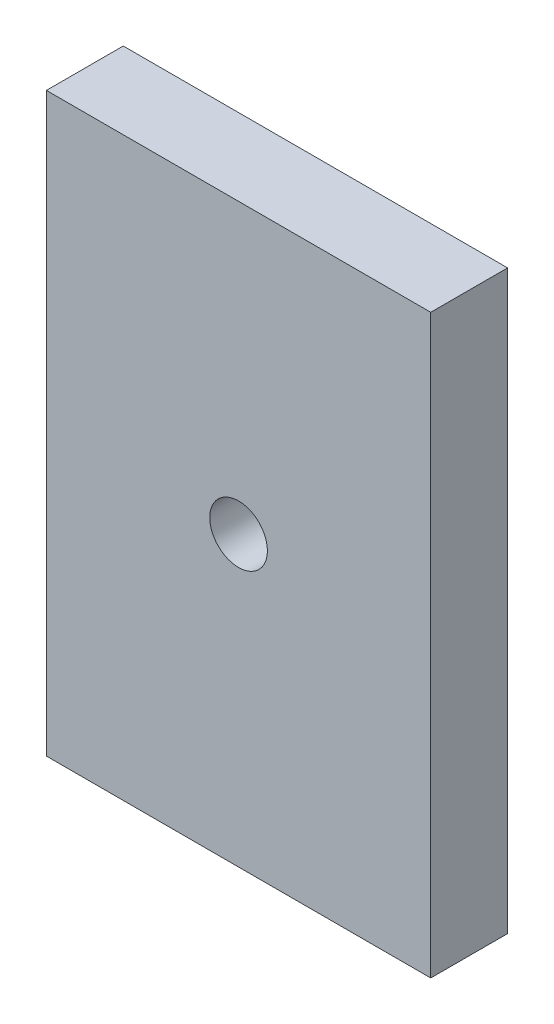
ISO-10303-21;
HEADER;
FILE_DESCRIPTION(('STEP AP214'),'2;1');
FILE_NAME('part.step','',(''),(''),'','','');
FILE_SCHEMA(('AUTOMOTIVE_DESIGN { 1 0 10303 214 1 1 1 1 }'));
ENDSEC;
DATA;
#1=APPLICATION_CONTEXT('core data for automotive mechanical design processes');
#2=APPLICATION_PROTOCOL_DEFINITION('international standard','automotive_design',2000,#1);
#3=PRODUCT_CONTEXT('',#1,'mechanical');
#4=PRODUCT('Part','Part','',(#3));
#5=PRODUCT_RELATED_PRODUCT_CATEGORY('part','',(#4));
#6=PRODUCT_DEFINITION_FORMATION('','',#4);
#7=PRODUCT_DEFINITION_CONTEXT('part definition',#1,'design');
#8=PRODUCT_DEFINITION('design','',#6,#7);
#9=PRODUCT_DEFINITION_SHAPE('','',#8);
#10=(LENGTH_UNIT() NAMED_UNIT(*) SI_UNIT(.MILLI.,.METRE.));
#11=(NAMED_UNIT(*) PLANE_ANGLE_UNIT() SI_UNIT($,.RADIAN.));
#12=(NAMED_UNIT(*) SI_UNIT($,.STERADIAN.) SOLID_ANGLE_UNIT());
#13=UNCERTAINTY_MEASURE_WITH_UNIT(LENGTH_MEASURE(1.E-05),#10,'distance_accuracy_value','');
#14=(GEOMETRIC_REPRESENTATION_CONTEXT(3) GLOBAL_UNCERTAINTY_ASSIGNED_CONTEXT((#13)) GLOBAL_UNIT_ASSIGNED_CONTEXT((#10,
#11,#12)) REPRESENTATION_CONTEXT('',''));
#15=CARTESIAN_POINT('',(0.,0.,0.));
#16=DIRECTION('',(0.,0.,1.));
#17=DIRECTION('',(1.,0.,0.));
#18=AXIS2_PLACEMENT_3D('',#15,#16,#17);
#19=CARTESIAN_POINT('',(10.,-15.,4.));
#20=DIRECTION('',(-1.,0.,0.));
#21=DIRECTION('',(0.,0.,1.));
#22=AXIS2_PLACEMENT_3D('',#19,#20,#21);
#23=PLANE('',#22);
#24=DIRECTION('',(0.,1.,0.));
#25=VECTOR('',#24,1.);
#26=CARTESIAN_POINT('',(10.,-15.,0.));
#27=LINE('',#26,#25);
#28=CARTESIAN_POINT('',(10.,-15.,0.));
#29=VERTEX_POINT('',#28);
#30=CARTESIAN_POINT('',(10.,15.,0.));
#31=VERTEX_POINT('',#30);
#32=EDGE_CURVE('E96',#29,#31,#27,.T.);
#33=ORIENTED_EDGE('',*,*,#32,.T.);
#34=DIRECTION('',(0.,0.,-1.));
#35=VECTOR('',#34,1.);
#36=CARTESIAN_POINT('',(10.,15.,4.));
#37=LINE('',#36,#35);
#38=CARTESIAN_POINT('',(10.,15.,4.));
#39=VERTEX_POINT('',#38);
#40=EDGE_CURVE('E11',#39,#31,#37,.T.);
#41=ORIENTED_EDGE('',*,*,#40,.F.);
#42=DIRECTION('',(0.,1.,0.));
#43=VECTOR('',#42,1.);
#44=CARTESIAN_POINT('',(10.,-15.,4.));
#45=LINE('',#44,#43);
#46=CARTESIAN_POINT('',(10.,-15.,4.));
#47=VERTEX_POINT('',#46);
#48=EDGE_CURVE('E84',#47,#39,#45,.T.);
#49=ORIENTED_EDGE('',*,*,#48,.F.);
#50=DIRECTION('',(0.,0.,-1.));
#51=VECTOR('',#50,1.);
#52=CARTESIAN_POINT('',(10.,-15.,4.));
#53=LINE('',#52,#51);
#54=EDGE_CURVE('E92',#47,#29,#53,.T.);
#55=ORIENTED_EDGE('',*,*,#54,.T.);
#56=EDGE_LOOP('',(#33,#41,#49,#55));
#57=FACE_BOUND('',#56,.T.);
#58=ADVANCED_FACE('F33',(#57),#23,.F.);
#59=CARTESIAN_POINT('',(-10.,15.,4.));
#60=DIRECTION('',(0.,-1.,0.));
#61=DIRECTION('',(0.,0.,-1.));
#62=AXIS2_PLACEMENT_3D('',#59,#60,#61);
#63=PLANE('',#62);
#64=DIRECTION('',(-1.,0.,0.));
#65=VECTOR('',#64,1.);
#66=CARTESIAN_POINT('',(-10.,15.,0.));
#67=LINE('',#66,#65);
#68=CARTESIAN_POINT('',(-10.,15.,0.));
#69=VERTEX_POINT('',#68);
#70=EDGE_CURVE('E88',#31,#69,#67,.T.);
#71=ORIENTED_EDGE('',*,*,#70,.T.);
#72=DIRECTION('',(0.,0.,-1.));
#73=VECTOR('',#72,1.);
#74=CARTESIAN_POINT('',(-10.,15.,4.));
#75=LINE('',#74,#73);
#76=CARTESIAN_POINT('',(-10.,15.,4.));
#77=VERTEX_POINT('',#76);
#78=EDGE_CURVE('E41',#77,#69,#75,.T.);
#79=ORIENTED_EDGE('',*,*,#78,.F.);
#80=DIRECTION('',(-1.,0.,0.));
#81=VECTOR('',#80,1.);
#82=CARTESIAN_POINT('',(-10.,15.,4.));
#83=LINE('',#82,#81);
#84=EDGE_CURVE('E79',#39,#77,#83,.T.);
#85=ORIENTED_EDGE('',*,*,#84,.F.);
#86=ORIENTED_EDGE('',*,*,#40,.T.);
#87=EDGE_LOOP('',(#71,#79,#85,#86));
#88=FACE_BOUND('',#87,.T.);
#89=ADVANCED_FACE('F87',(#88),#63,.F.);
#90=CARTESIAN_POINT('',(-10.,-15.,4.));
#91=DIRECTION('',(1.,0.,0.));
#92=DIRECTION('',(0.,0.,-1.));
#93=AXIS2_PLACEMENT_3D('',#90,#91,#92);
#94=PLANE('',#93);
#95=DIRECTION('',(0.,-1.,0.));
#96=VECTOR('',#95,1.);
#97=CARTESIAN_POINT('',(-10.,-15.,0.));
#98=LINE('',#97,#96);
#99=CARTESIAN_POINT('',(-10.,-15.,0.));
#100=VERTEX_POINT('',#99);
#101=EDGE_CURVE('E66',#69,#100,#98,.T.);
#102=ORIENTED_EDGE('',*,*,#101,.T.);
#103=DIRECTION('',(0.,0.,-1.));
#104=VECTOR('',#103,1.);
#105=CARTESIAN_POINT('',(-10.,-15.,4.));
#106=LINE('',#105,#104);
#107=CARTESIAN_POINT('',(-10.,-15.,4.));
#108=VERTEX_POINT('',#107);
#109=EDGE_CURVE('E89',#108,#100,#106,.T.);
#110=ORIENTED_EDGE('',*,*,#109,.F.);
#111=DIRECTION('',(0.,-1.,0.));
#112=VECTOR('',#111,1.);
#113=CARTESIAN_POINT('',(-10.,-15.,4.));
#114=LINE('',#113,#112);
#115=EDGE_CURVE('E82',#77,#108,#114,.T.);
#116=ORIENTED_EDGE('',*,*,#115,.F.);
#117=ORIENTED_EDGE('',*,*,#78,.T.);
#118=EDGE_LOOP('',(#102,#110,#116,#117));
#119=FACE_BOUND('',#118,.T.);
#120=ADVANCED_FACE('F90',(#119),#94,.F.);
#121=CARTESIAN_POINT('',(-10.,-15.,4.));
#122=DIRECTION('',(0.,1.,0.));
#123=DIRECTION('',(0.,0.,1.));
#124=AXIS2_PLACEMENT_3D('',#121,#122,#123);
#125=PLANE('',#124);
#126=DIRECTION('',(1.,0.,0.));
#127=VECTOR('',#126,1.);
#128=CARTESIAN_POINT('',(-10.,-15.,0.));
#129=LINE('',#128,#127);
#130=EDGE_CURVE('E72',#100,#29,#129,.T.);
#131=ORIENTED_EDGE('',*,*,#130,.T.);
#132=ORIENTED_EDGE('',*,*,#54,.F.);
#133=DIRECTION('',(1.,0.,0.));
#134=VECTOR('',#133,1.);
#135=CARTESIAN_POINT('',(-10.,-15.,4.));
#136=LINE('',#135,#134);
#137=EDGE_CURVE('E49',#108,#47,#136,.T.);
#138=ORIENTED_EDGE('',*,*,#137,.F.);
#139=ORIENTED_EDGE('',*,*,#109,.T.);
#140=EDGE_LOOP('',(#131,#132,#138,#139));
#141=FACE_BOUND('',#140,.T.);
#142=ADVANCED_FACE('F104',(#141),#125,.F.);
#143=CARTESIAN_POINT('',(0.,0.,4.));
#144=DIRECTION('',(0.,0.,-1.));
#145=DIRECTION('',(-1.,0.,0.));
#146=AXIS2_PLACEMENT_3D('',#143,#144,#145);
#147=PLANE('',#146);
#148=CARTESIAN_POINT('',(0.,0.,4.));
#149=DIRECTION('',(0.,0.,1.));
#150=DIRECTION('',(1.,0.,0.));
#151=AXIS2_PLACEMENT_3D('',#148,#149,#150);
#152=CIRCLE('',#151,1.5);
#153=CARTESIAN_POINT('',(1.5,0.,4.));
#154=VERTEX_POINT('',#153);
#155=EDGE_CURVE('E110',#154,#154,#152,.T.);
#156=ORIENTED_EDGE('',*,*,#155,.F.);
#157=EDGE_LOOP('',(#156));
#158=FACE_BOUND('',#157,.T.);
#159=ORIENTED_EDGE('',*,*,#48,.T.);
#160=ORIENTED_EDGE('',*,*,#84,.T.);
#161=ORIENTED_EDGE('',*,*,#115,.T.);
#162=ORIENTED_EDGE('',*,*,#137,.T.);
#163=EDGE_LOOP('',(#159,#160,#161,#162));
#164=FACE_BOUND('',#163,.T.);
#165=ADVANCED_FACE('F80',(#158,#164),#147,.F.);
#166=CARTESIAN_POINT('',(0.,0.,0.));
#167=DIRECTION('',(0.,0.,-1.));
#168=DIRECTION('',(-1.,0.,0.));
#169=AXIS2_PLACEMENT_3D('',#166,#167,#168);
#170=PLANE('',#169);
#171=CARTESIAN_POINT('',(0.,0.,0.));
#172=DIRECTION('',(0.,0.,1.));
#173=DIRECTION('',(1.,0.,0.));
#174=AXIS2_PLACEMENT_3D('',#171,#172,#173);
#175=CIRCLE('',#174,1.5);
#176=CARTESIAN_POINT('',(1.5,0.,0.));
#177=VERTEX_POINT('',#176);
#178=EDGE_CURVE('E99',#177,#177,#175,.T.);
#179=ORIENTED_EDGE('',*,*,#178,.T.);
#180=EDGE_LOOP('',(#179));
#181=FACE_BOUND('',#180,.T.);
#182=ORIENTED_EDGE('',*,*,#32,.F.);
#183=ORIENTED_EDGE('',*,*,#130,.F.);
#184=ORIENTED_EDGE('',*,*,#101,.F.);
#185=ORIENTED_EDGE('',*,*,#70,.F.);
#186=EDGE_LOOP('',(#182,#183,#184,#185));
#187=FACE_BOUND('',#186,.T.);
#188=ADVANCED_FACE('F107',(#181,#187),#170,.T.);
#189=CARTESIAN_POINT('',(0.,0.,0.));
#190=DIRECTION('',(0.,0.,1.));
#191=DIRECTION('',(1.,0.,0.));
#192=AXIS2_PLACEMENT_3D('',#189,#190,#191);
#193=CYLINDRICAL_SURFACE('',#192,1.5);
#194=ORIENTED_EDGE('',*,*,#178,.F.);
#195=EDGE_LOOP('',(#194));
#196=FACE_BOUND('',#195,.T.);
#197=ORIENTED_EDGE('',*,*,#155,.T.);
#198=EDGE_LOOP('',(#197));
#199=FACE_BOUND('',#198,.T.);
#200=ADVANCED_FACE('F117',(#196,#199),#193,.F.);
#201=CLOSED_SHELL('',(#58,#89,#120,#142,#165,#188,#200));
#202=MANIFOLD_SOLID_BREP('B2',#201);
#203=ADVANCED_BREP_SHAPE_REPRESENTATION('',(#18,#202),#14);
#204=SHAPE_DEFINITION_REPRESENTATION(#9,#203);
ENDSEC;
END-ISO-10303-21;
